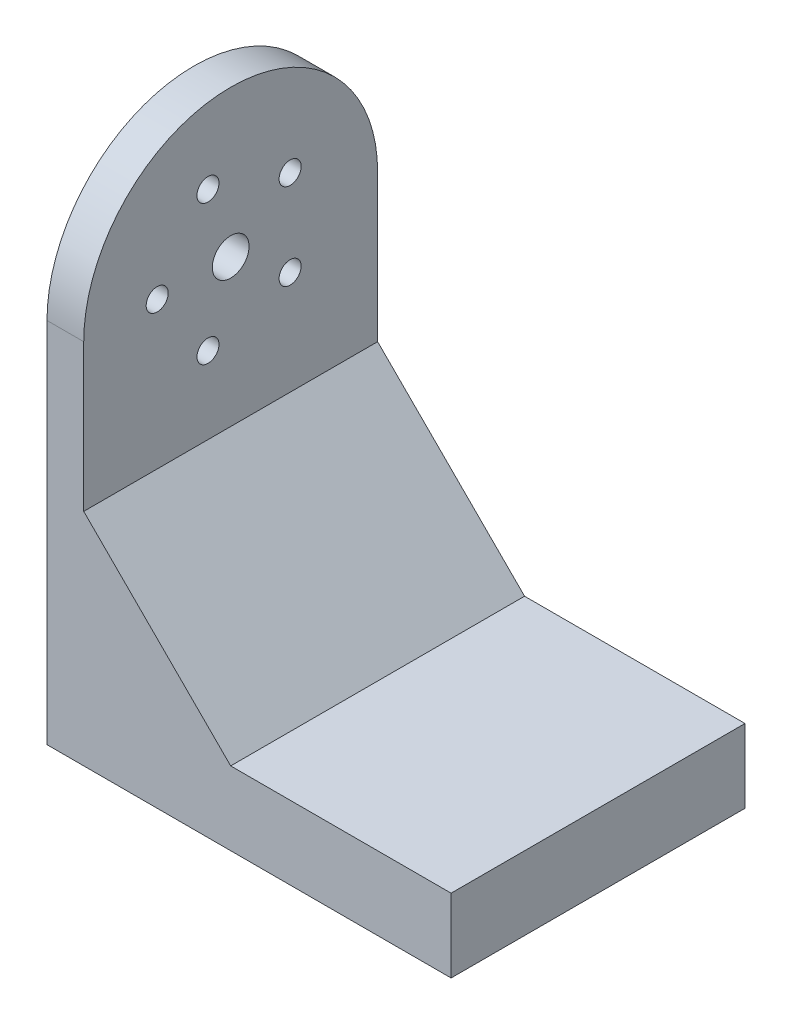
ISO-10303-21;
HEADER;
FILE_DESCRIPTION(('STEP AP214'),'2;1');
FILE_NAME('part.step','',(''),(''),'','','');
FILE_SCHEMA(('AUTOMOTIVE_DESIGN { 1 0 10303 214 1 1 1 1 }'));
ENDSEC;
DATA;
#1=APPLICATION_CONTEXT('core data for automotive mechanical design processes');
#2=APPLICATION_PROTOCOL_DEFINITION('international standard','automotive_design',2000,#1);
#3=PRODUCT_CONTEXT('',#1,'mechanical');
#4=PRODUCT('Part','Part','',(#3));
#5=PRODUCT_RELATED_PRODUCT_CATEGORY('part','',(#4));
#6=PRODUCT_DEFINITION_FORMATION('','',#4);
#7=PRODUCT_DEFINITION_CONTEXT('part definition',#1,'design');
#8=PRODUCT_DEFINITION('design','',#6,#7);
#9=PRODUCT_DEFINITION_SHAPE('','',#8);
#10=(LENGTH_UNIT() NAMED_UNIT(*) SI_UNIT(.MILLI.,.METRE.));
#11=(NAMED_UNIT(*) PLANE_ANGLE_UNIT() SI_UNIT($,.RADIAN.));
#12=(NAMED_UNIT(*) SI_UNIT($,.STERADIAN.) SOLID_ANGLE_UNIT());
#13=UNCERTAINTY_MEASURE_WITH_UNIT(LENGTH_MEASURE(1.E-05),#10,'distance_accuracy_value','');
#14=(GEOMETRIC_REPRESENTATION_CONTEXT(3) GLOBAL_UNCERTAINTY_ASSIGNED_CONTEXT((#13)) GLOBAL_UNIT_ASSIGNED_CONTEXT((#10,
#11,#12)) REPRESENTATION_CONTEXT('',''));
#15=CARTESIAN_POINT('',(0.,0.,0.));
#16=DIRECTION('',(0.,0.,1.));
#17=DIRECTION('',(1.,0.,0.));
#18=AXIS2_PLACEMENT_3D('',#15,#16,#17);
#19=CARTESIAN_POINT('',(5.,0.,-20.));
#20=DIRECTION('',(0.,0.,1.));
#21=DIRECTION('',(1.,0.,0.));
#22=AXIS2_PLACEMENT_3D('',#19,#20,#21);
#23=PLANE('',#22);
#24=DIRECTION('',(0.,1.,0.));
#25=VECTOR('',#24,1.);
#26=CARTESIAN_POINT('',(0.,0.,-20.));
#27=LINE('',#26,#25);
#28=CARTESIAN_POINT('',(0.,-50.,-20.));
#29=VERTEX_POINT('',#28);
#30=CARTESIAN_POINT('',(0.,0.,-20.));
#31=VERTEX_POINT('',#30);
#32=EDGE_CURVE('E162',#29,#31,#27,.T.);
#33=ORIENTED_EDGE('',*,*,#32,.T.);
#34=DIRECTION('',(-1.,0.,0.));
#35=VECTOR('',#34,1.);
#36=CARTESIAN_POINT('',(5.,0.,-20.));
#37=LINE('',#36,#35);
#38=CARTESIAN_POINT('',(5.,0.,-20.));
#39=VERTEX_POINT('',#38);
#40=EDGE_CURVE('E188',#39,#31,#37,.T.);
#41=ORIENTED_EDGE('',*,*,#40,.F.);
#42=DIRECTION('',(0.,1.,0.));
#43=VECTOR('',#42,1.);
#44=CARTESIAN_POINT('',(5.,0.,-20.));
#45=LINE('',#44,#43);
#46=CARTESIAN_POINT('',(5.,-20.0000000000001,-20.));
#47=VERTEX_POINT('',#46);
#48=EDGE_CURVE('E140',#47,#39,#45,.T.);
#49=ORIENTED_EDGE('',*,*,#48,.F.);
#50=DIRECTION('',(0.707106781186551,-0.707106781186544,0.));
#51=VECTOR('',#50,1.);
#52=CARTESIAN_POINT('',(-5.00000000000004,-10.0000000000001,-20.));
#53=LINE('',#52,#51);
#54=CARTESIAN_POINT('',(25.0000000000001,-40.,-20.));
#55=VERTEX_POINT('',#54);
#56=EDGE_CURVE('E11',#47,#55,#53,.T.);
#57=ORIENTED_EDGE('',*,*,#56,.T.);
#58=DIRECTION('',(-1.,0.,0.));
#59=VECTOR('',#58,1.);
#60=CARTESIAN_POINT('',(55.,-40.,-20.));
#61=LINE('',#60,#59);
#62=CARTESIAN_POINT('',(55.,-40.,-20.));
#63=VERTEX_POINT('',#62);
#64=EDGE_CURVE('E106',#63,#55,#61,.T.);
#65=ORIENTED_EDGE('',*,*,#64,.F.);
#66=DIRECTION('',(0.,1.,0.));
#67=VECTOR('',#66,1.);
#68=CARTESIAN_POINT('',(55.,-50.,-20.));
#69=LINE('',#68,#67);
#70=CARTESIAN_POINT('',(55.,-50.,-20.));
#71=VERTEX_POINT('',#70);
#72=EDGE_CURVE('E113',#71,#63,#69,.T.);
#73=ORIENTED_EDGE('',*,*,#72,.F.);
#74=DIRECTION('',(-1.,0.,0.));
#75=VECTOR('',#74,1.);
#76=CARTESIAN_POINT('',(5.,-50.,-20.));
#77=LINE('',#76,#75);
#78=EDGE_CURVE('E158',#71,#29,#77,.T.);
#79=ORIENTED_EDGE('',*,*,#78,.T.);
#80=EDGE_LOOP('',(#33,#41,#49,#57,#65,#73,#79));
#81=FACE_BOUND('',#80,.T.);
#82=ADVANCED_FACE('F43',(#81),#23,.F.);
#83=CARTESIAN_POINT('',(5.,0.,0.));
#84=DIRECTION('',(-1.,0.,0.));
#85=DIRECTION('',(0.,0.,1.));
#86=AXIS2_PLACEMENT_3D('',#83,#84,#85);
#87=CYLINDRICAL_SURFACE('',#86,20.);
#88=CARTESIAN_POINT('',(0.,0.,0.));
#89=DIRECTION('',(1.,0.,0.));
#90=DIRECTION('',(0.,0.,-1.));
#91=AXIS2_PLACEMENT_3D('',#88,#89,#90);
#92=CIRCLE('',#91,20.);
#93=CARTESIAN_POINT('',(0.,0.,20.));
#94=VERTEX_POINT('',#93);
#95=EDGE_CURVE('E164',#31,#94,#92,.T.);
#96=ORIENTED_EDGE('',*,*,#95,.T.);
#97=DIRECTION('',(-1.,0.,0.));
#98=VECTOR('',#97,1.);
#99=CARTESIAN_POINT('',(5.,0.,20.));
#100=LINE('',#99,#98);
#101=CARTESIAN_POINT('',(5.,0.,20.));
#102=VERTEX_POINT('',#101);
#103=EDGE_CURVE('E186',#102,#94,#100,.T.);
#104=ORIENTED_EDGE('',*,*,#103,.F.);
#105=CARTESIAN_POINT('',(5.,0.,0.));
#106=DIRECTION('',(1.,0.,0.));
#107=DIRECTION('',(0.,0.,-1.));
#108=AXIS2_PLACEMENT_3D('',#105,#106,#107);
#109=CIRCLE('',#108,20.);
#110=EDGE_CURVE('E142',#39,#102,#109,.T.);
#111=ORIENTED_EDGE('',*,*,#110,.F.);
#112=ORIENTED_EDGE('',*,*,#40,.T.);
#113=EDGE_LOOP('',(#96,#104,#111,#112));
#114=FACE_BOUND('',#113,.T.);
#115=ADVANCED_FACE('F208',(#114),#87,.T.);
#116=CARTESIAN_POINT('',(5.,0.,20.));
#117=DIRECTION('',(0.,0.,1.));
#118=DIRECTION('',(1.,0.,0.));
#119=AXIS2_PLACEMENT_3D('',#116,#117,#118);
#120=PLANE('',#119);
#121=DIRECTION('',(0.,1.,0.));
#122=VECTOR('',#121,1.);
#123=CARTESIAN_POINT('',(0.,0.,20.));
#124=LINE('',#123,#122);
#125=CARTESIAN_POINT('',(0.,-50.,20.));
#126=VERTEX_POINT('',#125);
#127=EDGE_CURVE('E167',#126,#94,#124,.T.);
#128=ORIENTED_EDGE('',*,*,#127,.F.);
#129=DIRECTION('',(-1.,0.,0.));
#130=VECTOR('',#129,1.);
#131=CARTESIAN_POINT('',(5.,-50.,20.));
#132=LINE('',#131,#130);
#133=CARTESIAN_POINT('',(55.,-50.,20.));
#134=VERTEX_POINT('',#133);
#135=EDGE_CURVE('E184',#134,#126,#132,.T.);
#136=ORIENTED_EDGE('',*,*,#135,.F.);
#137=DIRECTION('',(0.,-1.,0.));
#138=VECTOR('',#137,1.);
#139=CARTESIAN_POINT('',(55.,-50.,20.));
#140=LINE('',#139,#138);
#141=CARTESIAN_POINT('',(55.,-40.,20.));
#142=VERTEX_POINT('',#141);
#143=EDGE_CURVE('E112',#142,#134,#140,.T.);
#144=ORIENTED_EDGE('',*,*,#143,.F.);
#145=DIRECTION('',(-1.,0.,0.));
#146=VECTOR('',#145,1.);
#147=CARTESIAN_POINT('',(55.,-40.,20.));
#148=LINE('',#147,#146);
#149=CARTESIAN_POINT('',(25.0000000000001,-40.,20.));
#150=VERTEX_POINT('',#149);
#151=EDGE_CURVE('E108',#142,#150,#148,.T.);
#152=ORIENTED_EDGE('',*,*,#151,.T.);
#153=DIRECTION('',(-0.707106781186551,0.707106781186544,0.));
#154=VECTOR('',#153,1.);
#155=CARTESIAN_POINT('',(25.0000000000001,-40.,20.));
#156=LINE('',#155,#154);
#157=CARTESIAN_POINT('',(5.,-20.0000000000001,20.));
#158=VERTEX_POINT('',#157);
#159=EDGE_CURVE('E52',#150,#158,#156,.T.);
#160=ORIENTED_EDGE('',*,*,#159,.T.);
#161=DIRECTION('',(0.,1.,0.));
#162=VECTOR('',#161,1.);
#163=CARTESIAN_POINT('',(5.,0.,20.));
#164=LINE('',#163,#162);
#165=EDGE_CURVE('E145',#158,#102,#164,.T.);
#166=ORIENTED_EDGE('',*,*,#165,.T.);
#167=ORIENTED_EDGE('',*,*,#103,.T.);
#168=EDGE_LOOP('',(#128,#136,#144,#152,#160,#166,#167));
#169=FACE_BOUND('',#168,.T.);
#170=ADVANCED_FACE('F195',(#169),#120,.T.);
#171=CARTESIAN_POINT('',(5.,5.87785252292468,-8.09016994374951));
#172=DIRECTION('',(-1.,0.,0.));
#173=DIRECTION('',(0.,0.,1.));
#174=AXIS2_PLACEMENT_3D('',#171,#172,#173);
#175=CYLINDRICAL_SURFACE('',#174,1.5);
#176=CARTESIAN_POINT('',(5.,5.87785252292468,-8.09016994374951));
#177=DIRECTION('',(1.,0.,0.));
#178=DIRECTION('',(0.,0.,-1.));
#179=AXIS2_PLACEMENT_3D('',#176,#177,#178);
#180=CIRCLE('',#179,1.5);
#181=CARTESIAN_POINT('',(5.,5.87785252292468,-9.59016994374951));
#182=VERTEX_POINT('',#181);
#183=EDGE_CURVE('E153',#182,#182,#180,.T.);
#184=ORIENTED_EDGE('',*,*,#183,.T.);
#185=EDGE_LOOP('',(#184));
#186=FACE_BOUND('',#185,.T.);
#187=CARTESIAN_POINT('',(0.,5.87785252292468,-8.09016994374951));
#188=DIRECTION('',(1.,0.,0.));
#189=DIRECTION('',(0.,0.,-1.));
#190=AXIS2_PLACEMENT_3D('',#187,#188,#189);
#191=CIRCLE('',#190,1.5);
#192=CARTESIAN_POINT('',(0.,5.87785252292468,-9.59016994374951));
#193=VERTEX_POINT('',#192);
#194=EDGE_CURVE('E178',#193,#193,#191,.T.);
#195=ORIENTED_EDGE('',*,*,#194,.F.);
#196=EDGE_LOOP('',(#195));
#197=FACE_BOUND('',#196,.T.);
#198=ADVANCED_FACE('F253',(#186,#197),#175,.F.);
#199=CARTESIAN_POINT('',(5.,-5.8778525229248,-8.09016994374942));
#200=DIRECTION('',(-1.,0.,0.));
#201=DIRECTION('',(0.,0.,1.));
#202=AXIS2_PLACEMENT_3D('',#199,#200,#201);
#203=CYLINDRICAL_SURFACE('',#202,1.5);
#204=CARTESIAN_POINT('',(5.,-5.8778525229248,-8.09016994374942));
#205=DIRECTION('',(1.,0.,0.));
#206=DIRECTION('',(0.,0.,-1.));
#207=AXIS2_PLACEMENT_3D('',#204,#205,#206);
#208=CIRCLE('',#207,1.5);
#209=CARTESIAN_POINT('',(5.,-5.8778525229248,-9.59016994374942));
#210=VERTEX_POINT('',#209);
#211=EDGE_CURVE('E150',#210,#210,#208,.T.);
#212=ORIENTED_EDGE('',*,*,#211,.T.);
#213=EDGE_LOOP('',(#212));
#214=FACE_BOUND('',#213,.T.);
#215=CARTESIAN_POINT('',(0.,-5.8778525229248,-8.09016994374942));
#216=DIRECTION('',(1.,0.,0.));
#217=DIRECTION('',(0.,0.,-1.));
#218=AXIS2_PLACEMENT_3D('',#215,#216,#217);
#219=CIRCLE('',#218,1.5);
#220=CARTESIAN_POINT('',(0.,-5.8778525229248,-9.59016994374942));
#221=VERTEX_POINT('',#220);
#222=EDGE_CURVE('E175',#221,#221,#219,.T.);
#223=ORIENTED_EDGE('',*,*,#222,.F.);
#224=EDGE_LOOP('',(#223));
#225=FACE_BOUND('',#224,.T.);
#226=ADVANCED_FACE('F256',(#214,#225),#203,.F.);
#227=CARTESIAN_POINT('',(5.,-9.5105651629515,3.09016994374958));
#228=DIRECTION('',(-1.,0.,0.));
#229=DIRECTION('',(0.,0.,1.));
#230=AXIS2_PLACEMENT_3D('',#227,#228,#229);
#231=CYLINDRICAL_SURFACE('',#230,1.5);
#232=CARTESIAN_POINT('',(5.,-9.5105651629515,3.09016994374958));
#233=DIRECTION('',(1.,0.,0.));
#234=DIRECTION('',(0.,0.,-1.));
#235=AXIS2_PLACEMENT_3D('',#232,#233,#234);
#236=CIRCLE('',#235,1.5);
#237=CARTESIAN_POINT('',(5.,-9.5105651629515,1.59016994374958));
#238=VERTEX_POINT('',#237);
#239=EDGE_CURVE('E147',#238,#238,#236,.T.);
#240=ORIENTED_EDGE('',*,*,#239,.T.);
#241=EDGE_LOOP('',(#240));
#242=FACE_BOUND('',#241,.T.);
#243=CARTESIAN_POINT('',(0.,-9.5105651629515,3.09016994374958));
#244=DIRECTION('',(1.,0.,0.));
#245=DIRECTION('',(0.,0.,-1.));
#246=AXIS2_PLACEMENT_3D('',#243,#244,#245);
#247=CIRCLE('',#246,1.5);
#248=CARTESIAN_POINT('',(0.,-9.5105651629515,1.59016994374958));
#249=VERTEX_POINT('',#248);
#250=EDGE_CURVE('E172',#249,#249,#247,.T.);
#251=ORIENTED_EDGE('',*,*,#250,.F.);
#252=EDGE_LOOP('',(#251));
#253=FACE_BOUND('',#252,.T.);
#254=ADVANCED_FACE('F260',(#242,#253),#231,.F.);
#255=CARTESIAN_POINT('',(5.,-50.,0.));
#256=DIRECTION('',(0.,1.,0.));
#257=DIRECTION('',(0.,0.,1.));
#258=AXIS2_PLACEMENT_3D('',#255,#256,#257);
#259=PLANE('',#258);
#260=DIRECTION('',(0.,0.,-1.));
#261=VECTOR('',#260,1.);
#262=CARTESIAN_POINT('',(0.,-50.,0.));
#263=LINE('',#262,#261);
#264=EDGE_CURVE('E170',#126,#29,#263,.T.);
#265=ORIENTED_EDGE('',*,*,#264,.T.);
#266=ORIENTED_EDGE('',*,*,#78,.F.);
#267=DIRECTION('',(0.,0.,-1.));
#268=VECTOR('',#267,1.);
#269=CARTESIAN_POINT('',(55.,-50.,-20.));
#270=LINE('',#269,#268);
#271=EDGE_CURVE('E119',#134,#71,#270,.T.);
#272=ORIENTED_EDGE('',*,*,#271,.F.);
#273=ORIENTED_EDGE('',*,*,#135,.T.);
#274=EDGE_LOOP('',(#265,#266,#272,#273));
#275=FACE_BOUND('',#274,.T.);
#276=ADVANCED_FACE('F198',(#275),#259,.F.);
#277=CARTESIAN_POINT('',(5.,0.,10.));
#278=DIRECTION('',(-1.,0.,0.));
#279=DIRECTION('',(0.,0.,1.));
#280=AXIS2_PLACEMENT_3D('',#277,#278,#279);
#281=CYLINDRICAL_SURFACE('',#280,1.5);
#282=CARTESIAN_POINT('',(5.,0.,10.));
#283=DIRECTION('',(1.,0.,0.));
#284=DIRECTION('',(0.,0.,-1.));
#285=AXIS2_PLACEMENT_3D('',#282,#283,#284);
#286=CIRCLE('',#285,1.5);
#287=CARTESIAN_POINT('',(5.,0.,8.5));
#288=VERTEX_POINT('',#287);
#289=EDGE_CURVE('E136',#288,#288,#286,.T.);
#290=ORIENTED_EDGE('',*,*,#289,.T.);
#291=EDGE_LOOP('',(#290));
#292=FACE_BOUND('',#291,.T.);
#293=CARTESIAN_POINT('',(0.,0.,10.));
#294=DIRECTION('',(1.,0.,0.));
#295=DIRECTION('',(0.,0.,-1.));
#296=AXIS2_PLACEMENT_3D('',#293,#294,#295);
#297=CIRCLE('',#296,1.5);
#298=CARTESIAN_POINT('',(0.,0.,8.5));
#299=VERTEX_POINT('',#298);
#300=EDGE_CURVE('E128',#299,#299,#297,.T.);
#301=ORIENTED_EDGE('',*,*,#300,.F.);
#302=EDGE_LOOP('',(#301));
#303=FACE_BOUND('',#302,.T.);
#304=ADVANCED_FACE('F224',(#292,#303),#281,.F.);
#305=CARTESIAN_POINT('',(5.,0.,0.));
#306=DIRECTION('',(-1.,0.,0.));
#307=DIRECTION('',(0.,0.,1.));
#308=AXIS2_PLACEMENT_3D('',#305,#306,#307);
#309=CYLINDRICAL_SURFACE('',#308,2.5);
#310=CARTESIAN_POINT('',(5.,0.,0.));
#311=DIRECTION('',(1.,0.,0.));
#312=DIRECTION('',(0.,0.,-1.));
#313=AXIS2_PLACEMENT_3D('',#310,#311,#312);
#314=CIRCLE('',#313,2.5);
#315=CARTESIAN_POINT('',(5.,0.,-2.5));
#316=VERTEX_POINT('',#315);
#317=EDGE_CURVE('E133',#316,#316,#314,.T.);
#318=ORIENTED_EDGE('',*,*,#317,.T.);
#319=EDGE_LOOP('',(#318));
#320=FACE_BOUND('',#319,.T.);
#321=CARTESIAN_POINT('',(0.,0.,0.));
#322=DIRECTION('',(1.,0.,0.));
#323=DIRECTION('',(0.,0.,-1.));
#324=AXIS2_PLACEMENT_3D('',#321,#322,#323);
#325=CIRCLE('',#324,2.5);
#326=CARTESIAN_POINT('',(0.,0.,-2.5));
#327=VERTEX_POINT('',#326);
#328=EDGE_CURVE('E125',#327,#327,#325,.T.);
#329=ORIENTED_EDGE('',*,*,#328,.F.);
#330=EDGE_LOOP('',(#329));
#331=FACE_BOUND('',#330,.T.);
#332=ADVANCED_FACE('F226',(#320,#331),#309,.F.);
#333=CARTESIAN_POINT('',(5.,9.51056516295155,3.09016994374945));
#334=DIRECTION('',(-1.,0.,0.));
#335=DIRECTION('',(0.,0.,1.));
#336=AXIS2_PLACEMENT_3D('',#333,#334,#335);
#337=CYLINDRICAL_SURFACE('',#336,1.5);
#338=CARTESIAN_POINT('',(5.,9.51056516295155,3.09016994374945));
#339=DIRECTION('',(1.,0.,0.));
#340=DIRECTION('',(0.,0.,-1.));
#341=AXIS2_PLACEMENT_3D('',#338,#339,#340);
#342=CIRCLE('',#341,1.5);
#343=CARTESIAN_POINT('',(5.,9.51056516295155,1.59016994374945));
#344=VERTEX_POINT('',#343);
#345=EDGE_CURVE('E156',#344,#344,#342,.T.);
#346=ORIENTED_EDGE('',*,*,#345,.T.);
#347=EDGE_LOOP('',(#346));
#348=FACE_BOUND('',#347,.T.);
#349=CARTESIAN_POINT('',(0.,9.51056516295155,3.09016994374945));
#350=DIRECTION('',(1.,0.,0.));
#351=DIRECTION('',(0.,0.,-1.));
#352=AXIS2_PLACEMENT_3D('',#349,#350,#351);
#353=CIRCLE('',#352,1.5);
#354=CARTESIAN_POINT('',(0.,9.51056516295155,1.59016994374945));
#355=VERTEX_POINT('',#354);
#356=EDGE_CURVE('E137',#355,#355,#353,.T.);
#357=ORIENTED_EDGE('',*,*,#356,.F.);
#358=EDGE_LOOP('',(#357));
#359=FACE_BOUND('',#358,.T.);
#360=ADVANCED_FACE('F229',(#348,#359),#337,.F.);
#361=CARTESIAN_POINT('',(5.,0.,0.));
#362=DIRECTION('',(1.,0.,0.));
#363=DIRECTION('',(0.,0.,-1.));
#364=AXIS2_PLACEMENT_3D('',#361,#362,#363);
#365=PLANE('',#364);
#366=ORIENTED_EDGE('',*,*,#165,.F.);
#367=DIRECTION('',(0.,0.,-1.));
#368=VECTOR('',#367,1.);
#369=CARTESIAN_POINT('',(5.,-20.0000000000001,0.));
#370=LINE('',#369,#368);
#371=EDGE_CURVE('E65',#158,#47,#370,.T.);
#372=ORIENTED_EDGE('',*,*,#371,.T.);
#373=ORIENTED_EDGE('',*,*,#48,.T.);
#374=ORIENTED_EDGE('',*,*,#110,.T.);
#375=EDGE_LOOP('',(#366,#372,#373,#374));
#376=FACE_BOUND('',#375,.T.);
#377=ORIENTED_EDGE('',*,*,#317,.F.);
#378=EDGE_LOOP('',(#377));
#379=FACE_BOUND('',#378,.T.);
#380=ORIENTED_EDGE('',*,*,#289,.F.);
#381=EDGE_LOOP('',(#380));
#382=FACE_BOUND('',#381,.T.);
#383=ORIENTED_EDGE('',*,*,#239,.F.);
#384=EDGE_LOOP('',(#383));
#385=FACE_BOUND('',#384,.T.);
#386=ORIENTED_EDGE('',*,*,#211,.F.);
#387=EDGE_LOOP('',(#386));
#388=FACE_BOUND('',#387,.T.);
#389=ORIENTED_EDGE('',*,*,#183,.F.);
#390=EDGE_LOOP('',(#389));
#391=FACE_BOUND('',#390,.T.);
#392=ORIENTED_EDGE('',*,*,#345,.F.);
#393=EDGE_LOOP('',(#392));
#394=FACE_BOUND('',#393,.T.);
#395=ADVANCED_FACE('F234',(#376,#379,#382,#385,#388,#391,#394),#365,.T.);
#396=CARTESIAN_POINT('',(0.,0.,0.));
#397=DIRECTION('',(1.,0.,0.));
#398=DIRECTION('',(0.,0.,-1.));
#399=AXIS2_PLACEMENT_3D('',#396,#397,#398);
#400=PLANE('',#399);
#401=ORIENTED_EDGE('',*,*,#328,.T.);
#402=EDGE_LOOP('',(#401));
#403=FACE_BOUND('',#402,.T.);
#404=ORIENTED_EDGE('',*,*,#300,.T.);
#405=EDGE_LOOP('',(#404));
#406=FACE_BOUND('',#405,.T.);
#407=ORIENTED_EDGE('',*,*,#32,.F.);
#408=ORIENTED_EDGE('',*,*,#264,.F.);
#409=ORIENTED_EDGE('',*,*,#127,.T.);
#410=ORIENTED_EDGE('',*,*,#95,.F.);
#411=EDGE_LOOP('',(#407,#408,#409,#410));
#412=FACE_BOUND('',#411,.T.);
#413=ORIENTED_EDGE('',*,*,#250,.T.);
#414=EDGE_LOOP('',(#413));
#415=FACE_BOUND('',#414,.T.);
#416=ORIENTED_EDGE('',*,*,#222,.T.);
#417=EDGE_LOOP('',(#416));
#418=FACE_BOUND('',#417,.T.);
#419=ORIENTED_EDGE('',*,*,#194,.T.);
#420=EDGE_LOOP('',(#419));
#421=FACE_BOUND('',#420,.T.);
#422=ORIENTED_EDGE('',*,*,#356,.T.);
#423=EDGE_LOOP('',(#422));
#424=FACE_BOUND('',#423,.T.);
#425=ADVANCED_FACE('F203',(#403,#406,#412,#415,#418,#421,#424),#400,.F.);
#426=CARTESIAN_POINT('',(55.,-40.,-20.));
#427=DIRECTION('',(0.,-1.,0.));
#428=DIRECTION('',(0.,0.,-1.));
#429=AXIS2_PLACEMENT_3D('',#426,#427,#428);
#430=PLANE('',#429);
#431=ORIENTED_EDGE('',*,*,#64,.T.);
#432=DIRECTION('',(0.,0.,1.));
#433=VECTOR('',#432,1.);
#434=CARTESIAN_POINT('',(25.0000000000001,-40.,-20.));
#435=LINE('',#434,#433);
#436=EDGE_CURVE('E191',#55,#150,#435,.T.);
#437=ORIENTED_EDGE('',*,*,#436,.T.);
#438=ORIENTED_EDGE('',*,*,#151,.F.);
#439=DIRECTION('',(0.,0.,1.));
#440=VECTOR('',#439,1.);
#441=CARTESIAN_POINT('',(55.,-40.,-20.));
#442=LINE('',#441,#440);
#443=EDGE_CURVE('E101',#63,#142,#442,.T.);
#444=ORIENTED_EDGE('',*,*,#443,.F.);
#445=EDGE_LOOP('',(#431,#437,#438,#444));
#446=FACE_BOUND('',#445,.T.);
#447=ADVANCED_FACE('F103',(#446),#430,.F.);
#448=CARTESIAN_POINT('',(55.,0.,0.));
#449=DIRECTION('',(1.,0.,0.));
#450=DIRECTION('',(0.,0.,-1.));
#451=AXIS2_PLACEMENT_3D('',#448,#449,#450);
#452=PLANE('',#451);
#453=ORIENTED_EDGE('',*,*,#72,.T.);
#454=ORIENTED_EDGE('',*,*,#443,.T.);
#455=ORIENTED_EDGE('',*,*,#143,.T.);
#456=ORIENTED_EDGE('',*,*,#271,.T.);
#457=EDGE_LOOP('',(#453,#454,#455,#456));
#458=FACE_BOUND('',#457,.T.);
#459=ADVANCED_FACE('F117',(#458),#452,.T.);
#460=CARTESIAN_POINT('',(25.0000000000001,-40.,-20.));
#461=DIRECTION('',(-0.707106781186544,-0.707106781186551,0.));
#462=DIRECTION('',(0.,0.,1.));
#463=AXIS2_PLACEMENT_3D('',#460,#461,#462);
#464=PLANE('',#463);
#465=ORIENTED_EDGE('',*,*,#56,.F.);
#466=ORIENTED_EDGE('',*,*,#371,.F.);
#467=ORIENTED_EDGE('',*,*,#159,.F.);
#468=ORIENTED_EDGE('',*,*,#436,.F.);
#469=EDGE_LOOP('',(#465,#466,#467,#468));
#470=FACE_BOUND('',#469,.T.);
#471=ADVANCED_FACE('F46',(#470),#464,.F.);
#472=CLOSED_SHELL('',(#82,#115,#170,#198,#226,#254,#276,#304,#332,#360,#395,#425,#447,#459,#471));
#473=MANIFOLD_SOLID_BREP('B2',#472);
#474=ADVANCED_BREP_SHAPE_REPRESENTATION('',(#18,#473),#14);
#475=SHAPE_DEFINITION_REPRESENTATION(#9,#474);
ENDSEC;
END-ISO-10303-21;
